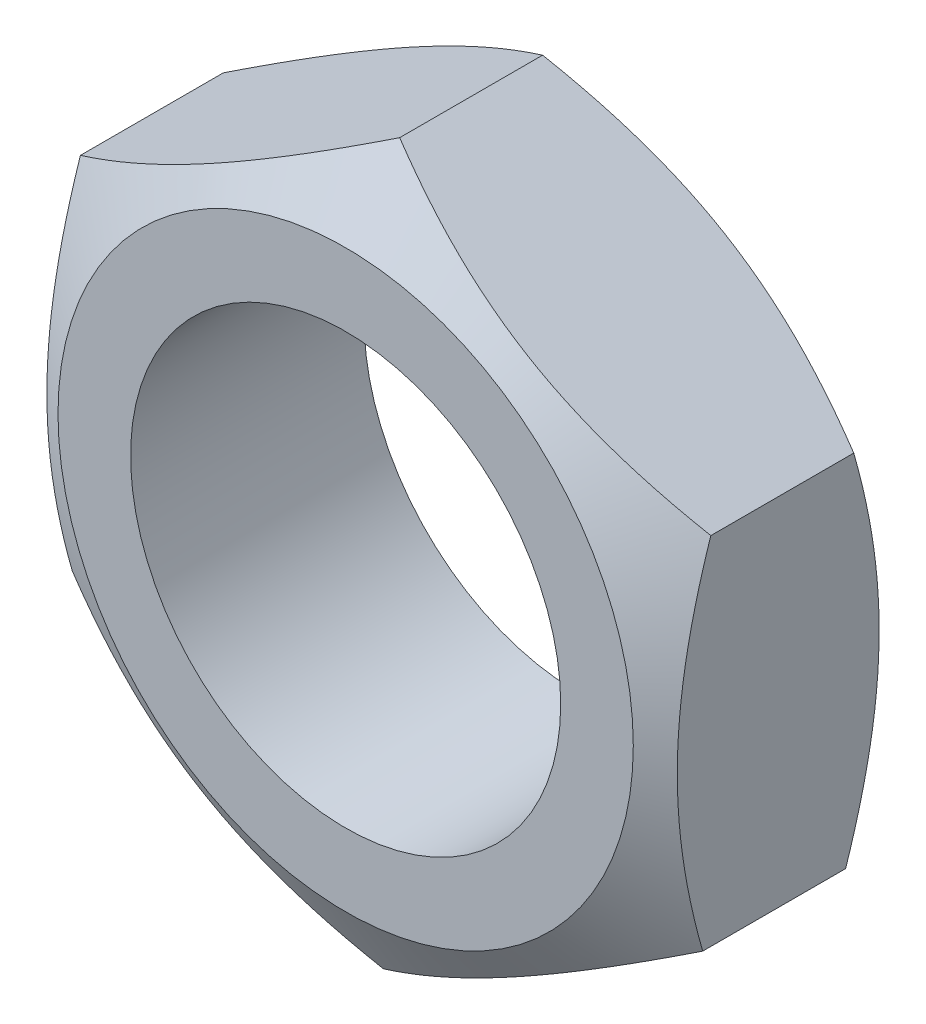
ISO-10303-21;
HEADER;
FILE_DESCRIPTION(('STEP AP214'),'2;1');
FILE_NAME('part.step','',(''),(''),'','','');
FILE_SCHEMA(('AUTOMOTIVE_DESIGN { 1 0 10303 214 1 1 1 1 }'));
ENDSEC;
DATA;
#1=APPLICATION_CONTEXT('core data for automotive mechanical design processes');
#2=APPLICATION_PROTOCOL_DEFINITION('international standard','automotive_design',2000,#1);
#3=PRODUCT_CONTEXT('',#1,'mechanical');
#4=PRODUCT('Part','Part','',(#3));
#5=PRODUCT_RELATED_PRODUCT_CATEGORY('part','',(#4));
#6=PRODUCT_DEFINITION_FORMATION('','',#4);
#7=PRODUCT_DEFINITION_CONTEXT('part definition',#1,'design');
#8=PRODUCT_DEFINITION('design','',#6,#7);
#9=PRODUCT_DEFINITION_SHAPE('','',#8);
#10=(LENGTH_UNIT() NAMED_UNIT(*) SI_UNIT(.MILLI.,.METRE.));
#11=(NAMED_UNIT(*) PLANE_ANGLE_UNIT() SI_UNIT($,.RADIAN.));
#12=(NAMED_UNIT(*) SI_UNIT($,.STERADIAN.) SOLID_ANGLE_UNIT());
#13=UNCERTAINTY_MEASURE_WITH_UNIT(LENGTH_MEASURE(1.E-05),#10,'distance_accuracy_value','');
#14=(GEOMETRIC_REPRESENTATION_CONTEXT(3) GLOBAL_UNCERTAINTY_ASSIGNED_CONTEXT((#13)) GLOBAL_UNIT_ASSIGNED_CONTEXT((#10,
#11,#12)) REPRESENTATION_CONTEXT('',''));
#15=CARTESIAN_POINT('',(0.,0.,0.));
#16=DIRECTION('',(0.,0.,1.));
#17=DIRECTION('',(1.,0.,0.));
#18=AXIS2_PLACEMENT_3D('',#15,#16,#17);
#19=CARTESIAN_POINT('',(0.348146008174675,15.5845691104051,10.));
#20=DIRECTION('',(0.480533842384557,-0.876976183441223,0.));
#21=DIRECTION('',(0.876976183441223,0.480533842384557,0.));
#22=AXIS2_PLACEMENT_3D('',#19,#20,#21);
#23=PLANE('',#22);
#24=CARTESIAN_POINT('',(-13.3227597525577,8.09367825370692,1.91474879700733));
#25=CARTESIAN_POINT('',(-13.0211836543349,8.25892506882757,1.81144380766582));
#26=CARTESIAN_POINT('',(-12.7183366232978,8.42486828396485,1.71281104702541));
#27=CARTESIAN_POINT('',(-12.1100109289307,8.75819670137794,1.52622281394296));
#28=CARTESIAN_POINT('',(-11.8045313455138,8.92558240780996,1.43827125135241));
#29=CARTESIAN_POINT('',(-11.1902845482465,9.2621552580612,1.27424565307524));
#30=CARTESIAN_POINT('',(-10.8815109135654,9.43134592013611,1.19820264669275));
#31=CARTESIAN_POINT('',(-10.2616360306035,9.77100264620423,1.05969587984507));
#32=CARTESIAN_POINT('',(-9.95053493196341,9.94146862820272,0.997231254009499));
#33=CARTESIAN_POINT('',(-9.33464844275874,10.2789399378213,0.888695138455347));
#34=CARTESIAN_POINT('',(-9.0299167671724,10.4459158326412,0.842229769183673));
#35=CARTESIAN_POINT('',(-8.41894736776228,10.7806928523841,0.764503504753746));
#36=CARTESIAN_POINT('',(-8.11270961242546,10.9484939945745,0.73324292911783));
#37=CARTESIAN_POINT('',(-7.49969931931603,11.284389309785,0.686745807400355));
#38=CARTESIAN_POINT('',(-7.19292802011222,11.4524828041389,0.671488175139057));
#39=CARTESIAN_POINT('',(-6.57910024801364,11.7888260520609,0.65733061798929));
#40=CARTESIAN_POINT('',(-6.27204378550319,11.9570757999391,0.65843011913612));
#41=CARTESIAN_POINT('',(-5.70069806890619,12.2701412602221,0.675671082188222));
#42=CARTESIAN_POINT('',(-5.4363580994215,12.4149847618254,0.68971450821679));
#43=CARTESIAN_POINT('',(-4.90834885880868,12.7043042598882,0.729646425322509));
#44=CARTESIAN_POINT('',(-4.64467963949816,12.8487802279545,0.755535805172552));
#45=CARTESIAN_POINT('',(-4.11815783933102,13.1372846919421,0.818705045583946));
#46=CARTESIAN_POINT('',(-3.85530621131765,13.2813126657585,0.855995174327974));
#47=CARTESIAN_POINT('',(-3.33093541311632,13.5686385011138,0.941305276146218));
#48=CARTESIAN_POINT('',(-3.06941634139293,13.7119363086996,0.989326030691836));
#49=CARTESIAN_POINT('',(-2.27485721581141,14.147310218307,1.15086231754135));
#50=CARTESIAN_POINT('',(-1.7443033214066,14.4380240441603,1.28029878700025));
#51=CARTESIAN_POINT('',(-0.691697630845464,15.0147930221004,1.57354650828278));
#52=CARTESIAN_POINT('',(-0.169630075571799,15.3008568093011,1.73728363696309));
#53=CARTESIAN_POINT('',(0.348346008174675,15.5846786992061,1.91474879700733));
#54=B_SPLINE_CURVE_WITH_KNOTS('',3,(#24,#25,#26,#27,#28,#29,#30,#31,#32,#33,#34,#35,#36,#37,#38,
#39,#40,#41,#42,#43,#44,#45,#46,#47,#48,#49,#50,#51,#52,#53),.UNSPECIFIED.,.F.,.F.,(4,2,2,2,2,2,
2,2,2,2,2,2,2,2,4),(0.,1.07722236011842,2.1548378563849,3.23521610732159,4.31552548394719,
5.36693157631782,6.41835976259027,7.46840079383787,8.51840497968903,9.42341919909554,
10.3285013306383,11.2344010456826,12.1403667555333,13.9951707316978,15.8460071084866),.UNSPECIFIED.);
#55=CARTESIAN_POINT('',(-13.3225597525577,8.09378784250795,1.91468028121144));
#56=VERTEX_POINT('',#55);
#57=CARTESIAN_POINT('',(0.348146008174675,15.5845691104051,1.91468028121144));
#58=VERTEX_POINT('',#57);
#59=EDGE_CURVE('E53',#56,#58,#54,.T.);
#60=ORIENTED_EDGE('',*,*,#59,.F.);
#61=DIRECTION('',(0.,0.,-1.));
#62=VECTOR('',#61,1.);
#63=CARTESIAN_POINT('',(-13.3225597525577,8.09378784250795,10.));
#64=LINE('',#63,#62);
#65=CARTESIAN_POINT('',(-13.3225597525577,8.09378784250795,8.03428968243642));
#66=VERTEX_POINT('',#65);
#67=EDGE_CURVE('E46',#66,#56,#64,.T.);
#68=ORIENTED_EDGE('',*,*,#67,.F.);
#69=CARTESIAN_POINT('',(0.348346008174675,15.5846786992061,8.03422116664054));
#70=CARTESIAN_POINT('',(0.0467699099519139,15.4194318840855,8.13752615598205));
#71=CARTESIAN_POINT('',(-0.256077121085281,15.2534886689482,8.23615891662246));
#72=CARTESIAN_POINT('',(-0.864402815452306,14.9201602515351,8.4227471497049));
#73=CARTESIAN_POINT('',(-1.16988239886921,14.7527745451031,8.51069871229546));
#74=CARTESIAN_POINT('',(-1.78412919613652,14.4162016948518,8.67472431057262));
#75=CARTESIAN_POINT('',(-2.09290283081762,14.2470110327769,8.75076731695511));
#76=CARTESIAN_POINT('',(-2.71277771377951,13.9073543067088,8.8892740838028));
#77=CARTESIAN_POINT('',(-3.02387881241963,13.7368883247103,8.95173870963836));
#78=CARTESIAN_POINT('',(-3.63976530162429,13.3994170150917,9.06027482519252));
#79=CARTESIAN_POINT('',(-3.94449697721063,13.2324411202718,9.10674019446419));
#80=CARTESIAN_POINT('',(-4.55546637662075,12.897664100529,9.18446645889412));
#81=CARTESIAN_POINT('',(-4.86170413195757,12.7298629583386,9.21572703453004));
#82=CARTESIAN_POINT('',(-5.474714425067,12.393967643128,9.26222415624751));
#83=CARTESIAN_POINT('',(-5.78148572427081,12.2258741487742,9.27748178850881));
#84=CARTESIAN_POINT('',(-6.39531349636939,11.8895309008521,9.29163934565857));
#85=CARTESIAN_POINT('',(-6.70236995887984,11.721281152974,9.29053984451174));
#86=CARTESIAN_POINT('',(-7.27371567547684,11.4082156926909,9.27329888145964));
#87=CARTESIAN_POINT('',(-7.53805564496153,11.2633721910876,9.25925545543107));
#88=CARTESIAN_POINT('',(-8.06606488557435,10.9740526930248,9.21932353832535));
#89=CARTESIAN_POINT('',(-8.32973410488487,10.8295767249585,9.19343415847531));
#90=CARTESIAN_POINT('',(-8.85625590505201,10.5410722609709,9.13026491806392));
#91=CARTESIAN_POINT('',(-9.11910753306539,10.3970442871545,9.09297478931989));
#92=CARTESIAN_POINT('',(-9.64347833126671,10.1097184517992,9.00766468750165));
#93=CARTESIAN_POINT('',(-9.90499740299011,9.96642064421343,8.95964393295603));
#94=CARTESIAN_POINT('',(-10.6995565285716,9.531046734606,8.79810764610651));
#95=CARTESIAN_POINT('',(-11.2301104229764,9.24033290875269,8.66867117664762));
#96=CARTESIAN_POINT('',(-12.2827161135376,8.66356393081261,8.37542345536508));
#97=CARTESIAN_POINT('',(-12.8047836688112,8.37750014361196,8.21168632668477));
#98=CARTESIAN_POINT('',(-13.3227597525577,8.09367825370692,8.03422116664053));
#99=B_SPLINE_CURVE_WITH_KNOTS('',3,(#69,#70,#71,#72,#73,#74,#75,#76,#77,#78,#79,#80,#81,#82,#83,
#84,#85,#86,#87,#88,#89,#90,#91,#92,#93,#94,#95,#96,#97,#98),.UNSPECIFIED.,.F.,.F.,(4,2,2,2,2,2,
2,2,2,2,2,2,2,2,4),(0.,1.07722236011843,2.1548378563849,3.23521610732159,4.31552548394719,
5.36693157631781,6.41835976259027,7.46840079383787,8.51840497968903,9.42341919909554,
10.3285013306383,11.2344010456826,12.1403667555333,13.9951707316978,15.8460071084866),.UNSPECIFIED.);
#100=CARTESIAN_POINT('',(0.348146008174675,15.5845691104051,8.03428968243642));
#101=VERTEX_POINT('',#100);
#102=EDGE_CURVE('E131',#101,#66,#99,.T.);
#103=ORIENTED_EDGE('',*,*,#102,.F.);
#104=DIRECTION('',(0.,0.,-1.));
#105=VECTOR('',#104,1.);
#106=CARTESIAN_POINT('',(0.348146008174675,15.5845691104051,10.));
#107=LINE('',#106,#105);
#108=EDGE_CURVE('E108',#101,#58,#107,.T.);
#109=ORIENTED_EDGE('',*,*,#108,.T.);
#110=EDGE_LOOP('',(#60,#68,#103,#109));
#111=FACE_BOUND('',#110,.T.);
#112=ADVANCED_FACE('F33',(#111),#23,.F.);
#113=CARTESIAN_POINT('',(-13.3225597525577,8.09378784250795,10.));
#114=DIRECTION('',(0.9997505745663,-0.0223335768374375,0.));
#115=DIRECTION('',(0.0223335768374375,0.9997505745663,0.));
#116=AXIS2_PLACEMENT_3D('',#113,#114,#115);
#117=PLANE('',#116);
#118=CARTESIAN_POINT('',(-13.6707102285621,-7.49098126789712,1.91474038284253));
#119=CARTESIAN_POINT('',(-13.663030124391,-7.14718552869685,1.81143574092546));
#120=CARTESIAN_POINT('',(-13.655317653942,-6.80194093044568,1.71280333669261));
#121=CARTESIAN_POINT('',(-13.6398256945055,-6.10845168505808,1.52621583265449));
#122=CARTESIAN_POINT('',(-13.6320461820866,-5.76020598902686,1.43826464270555));
#123=CARTESIAN_POINT('',(-13.6164034329577,-5.05996672403161,1.27423980695369));
#124=CARTESIAN_POINT('',(-13.6085400327333,-4.70796583542905,1.19819719018768));
#125=CARTESIAN_POINT('',(-13.5927539561999,-4.00131059613291,1.05969121176616));
#126=CARTESIAN_POINT('',(-13.5848312837018,-3.64665641602829,0.997226984741185));
#127=CARTESIAN_POINT('',(-13.5691467775581,-2.9445479206848,0.888691653428463));
#128=CARTESIAN_POINT('',(-13.5613863118354,-2.59715483978193,0.842226670883884));
#129=CARTESIAN_POINT('',(-13.5458270268609,-1.90065180283952,0.764501176922913));
#130=CARTESIAN_POINT('',(-13.5380282068066,-1.55154181087499,0.733240985033619));
#131=CARTESIAN_POINT('',(-13.522416947929,-0.852712190068609,0.686744617427944));
#132=CARTESIAN_POINT('',(-13.5146045406471,-0.502993973158491,0.671487355704391));
#133=CARTESIAN_POINT('',(-13.4989724640727,0.196767540670505,0.657330517188794));
#134=CARTESIAN_POINT('',(-13.4911527950446,0.546810825751623,0.658430366420144));
#135=CARTESIAN_POINT('',(-13.4766026313398,1.19814109092995,0.675671899544916));
#136=CARTESIAN_POINT('',(-13.4698708450258,1.49948589047655,0.689715478356203));
#137=CARTESIAN_POINT('',(-13.4564243527259,2.10141089785779,0.729647531505815));
#138=CARTESIAN_POINT('',(-13.4497096480595,2.40199104662195,0.755536894585893));
#139=CARTESIAN_POINT('',(-13.4363010355972,3.00222038341377,0.818705938615438));
#140=CARTESIAN_POINT('',(-13.4296071520662,3.30186848523732,0.85599588738103));
#141=CARTESIAN_POINT('',(-13.4162533176948,3.89964571020233,0.941305478822691));
#142=CARTESIAN_POINT('',(-13.409593369362,4.19777472109764,0.989325902947332));
#143=CARTESIAN_POINT('',(-13.3893588142773,5.10356371402533,1.15086095399664));
#144=CARTESIAN_POINT('',(-13.3758475205419,5.70838952286716,1.28029629407202));
#145=CARTESIAN_POINT('',(-13.3490414489043,6.90834892554668,1.57354133350944));
#146=CARTESIAN_POINT('',(-13.3357462696846,7.5035004841442,1.73727691202011));
#147=CARTESIAN_POINT('',(-13.322555284728,8.09398784250795,1.91474038284253));
#148=B_SPLINE_CURVE_WITH_KNOTS('',3,(#118,#119,#120,#121,#122,#123,#124,#125,#126,#127,#128,
#129,#130,#131,#132,#133,#134,#135,#136,#137,#138,#139,#140,#141,#142,#143,#144,#145,#146,#147),
.UNSPECIFIED.,.F.,.F.,(4,2,2,2,2,2,2,2,2,2,2,2,2,2,4),(0.,1.07722139744809,2.15483593059128,
3.23521318892921,4.31552157313823,5.36692680094432,6.41835412296775,7.46839430136803,
8.51839763358703,9.42340564467492,10.3284815660259,11.234375047758,12.1403345228396,
13.9951253283491,15.8459486360334),.UNSPECIFIED.);
#149=CARTESIAN_POINT('',(-13.6707057607324,-7.49078126789712,1.91468028121143));
#150=VERTEX_POINT('',#149);
#151=EDGE_CURVE('E127',#150,#56,#148,.T.);
#152=ORIENTED_EDGE('',*,*,#151,.F.);
#153=DIRECTION('',(0.,0.,-1.));
#154=VECTOR('',#153,1.);
#155=CARTESIAN_POINT('',(-13.6707057607324,-7.49078126789712,10.));
#156=LINE('',#155,#154);
#157=CARTESIAN_POINT('',(-13.6707057607324,-7.49078126789712,8.03428968243643));
#158=VERTEX_POINT('',#157);
#159=EDGE_CURVE('E118',#158,#150,#156,.T.);
#160=ORIENTED_EDGE('',*,*,#159,.F.);
#161=CARTESIAN_POINT('',(-13.322555284728,8.09398784250795,8.03422958080533));
#162=CARTESIAN_POINT('',(-13.3302353888991,7.75019210330767,8.1375342227224));
#163=CARTESIAN_POINT('',(-13.3379478593481,7.40494750505651,8.23616662695525));
#164=CARTESIAN_POINT('',(-13.3534398187846,6.71145825966891,8.42275413099337));
#165=CARTESIAN_POINT('',(-13.3612193312035,6.36321256363769,8.51070532094231));
#166=CARTESIAN_POINT('',(-13.3768620803323,5.66297329864243,8.67473015669417));
#167=CARTESIAN_POINT('',(-13.3847254805568,5.31097241003988,8.75077277346018));
#168=CARTESIAN_POINT('',(-13.4005115570902,4.60431717074374,8.8892787518817));
#169=CARTESIAN_POINT('',(-13.4084342295883,4.24966299063912,8.95174297890668));
#170=CARTESIAN_POINT('',(-13.424118735732,3.54755449529562,9.0602783102194));
#171=CARTESIAN_POINT('',(-13.4318792014547,3.20016141439275,9.10674329276398));
#172=CARTESIAN_POINT('',(-13.4474384864292,2.50365837745034,9.18446878672495));
#173=CARTESIAN_POINT('',(-13.4552373064835,2.15454838548581,9.21572897861424));
#174=CARTESIAN_POINT('',(-13.4708485653611,1.45571876467943,9.26222534621992));
#175=CARTESIAN_POINT('',(-13.4786609726429,1.10600054776931,9.27748260794347));
#176=CARTESIAN_POINT('',(-13.4942930492174,0.406239033940319,9.29163944645907));
#177=CARTESIAN_POINT('',(-13.5021127182455,0.0561957488591996,9.29053959722772));
#178=CARTESIAN_POINT('',(-13.5166628819503,-0.595134516319126,9.27329806410295));
#179=CARTESIAN_POINT('',(-13.5233946682643,-0.896479315865732,9.25925448529166));
#180=CARTESIAN_POINT('',(-13.5368411605642,-1.49840432324696,9.21932243214205));
#181=CARTESIAN_POINT('',(-13.5435558652305,-1.79898447201113,9.19343306906197));
#182=CARTESIAN_POINT('',(-13.5569644776928,-2.39921380880295,9.13026402503242));
#183=CARTESIAN_POINT('',(-13.5636583612239,-2.6988619106265,9.09297407626683));
#184=CARTESIAN_POINT('',(-13.5770121955953,-3.29663913559151,9.00766448482517));
#185=CARTESIAN_POINT('',(-13.5836721439281,-3.59476814648681,8.95964406070053));
#186=CARTESIAN_POINT('',(-13.6039066990128,-4.5005571394145,8.79810900965123));
#187=CARTESIAN_POINT('',(-13.6174179927481,-5.10538294825633,8.66867366957585));
#188=CARTESIAN_POINT('',(-13.6442240643857,-6.30534235093585,8.37542863013842));
#189=CARTESIAN_POINT('',(-13.6575192436054,-6.90049390953337,8.21169305162776));
#190=CARTESIAN_POINT('',(-13.6707102285621,-7.49098126789712,8.03422958080533));
#191=B_SPLINE_CURVE_WITH_KNOTS('',3,(#161,#162,#163,#164,#165,#166,#167,#168,#169,#170,#171,
#172,#173,#174,#175,#176,#177,#178,#179,#180,#181,#182,#183,#184,#185,#186,#187,#188,#189,#190),
.UNSPECIFIED.,.F.,.F.,(4,2,2,2,2,2,2,2,2,2,2,2,2,2,4),(0.,1.07722139744809,2.15483593059129,
3.23521318892921,4.31552157313824,5.36692680094432,6.41835412296775,7.46839430136803,
8.51839763358703,9.42340564467493,10.3284815660259,11.234375047758,12.1403345228396,
13.9951253283491,15.8459486360334),.UNSPECIFIED.);
#192=EDGE_CURVE('E128',#66,#158,#191,.T.);
#193=ORIENTED_EDGE('',*,*,#192,.F.);
#194=ORIENTED_EDGE('',*,*,#67,.T.);
#195=EDGE_LOOP('',(#152,#160,#193,#194));
#196=FACE_BOUND('',#195,.T.);
#197=ADVANCED_FACE('F125',(#196),#117,.F.);
#198=CARTESIAN_POINT('',(-13.6707057607324,-7.49078126789712,10.));
#199=DIRECTION('',(0.519216732181743,0.854642606603785,0.));
#200=DIRECTION('',(-0.854642606603785,0.519216732181743,0.));
#201=AXIS2_PLACEMENT_3D('',#198,#199,#200);
#202=PLANE('',#201);
#203=CARTESIAN_POINT('',(-0.347946008174666,-15.584690615401,1.91475058748677));
#204=CARTESIAN_POINT('',(-0.641842039022055,-15.4061414352423,1.81144552421575));
#205=CARTESIAN_POINT('',(-0.936976636575299,-15.2268397948709,1.71281268773428));
#206=CARTESIAN_POINT('',(-1.52981044625024,-14.8666784467146,1.52622429951625));
#207=CARTESIAN_POINT('',(-1.82751055502793,-14.6858181941887,1.43827265763014));
#208=CARTESIAN_POINT('',(-2.42611468147581,-14.3221512344524,1.27424689709285));
#209=CARTESIAN_POINT('',(-2.72702495647683,-14.139340725757,1.19820380780267));
#210=CARTESIAN_POINT('',(-3.33111384580929,-13.7723416355608,1.05969687318333));
#211=CARTESIAN_POINT('',(-3.63429231431072,-13.5881531426553,0.997232162483605));
#212=CARTESIAN_POINT('',(-4.23449437794812,-13.2235153961604,0.888695880048261));
#213=CARTESIAN_POINT('',(-4.53146562593313,-13.0430979447728,0.842230428483715));
#214=CARTESIAN_POINT('',(-5.12687581915622,-12.6813713792538,0.764504000103262));
#215=CARTESIAN_POINT('',(-5.42531479510479,-12.500062246465,0.733243342808678));
#216=CARTESIAN_POINT('',(-6.02271391285686,-12.137127359612,0.686746060621332));
#217=CARTESIAN_POINT('',(-6.32167284762759,-11.9555023388504,0.671488349512107));
#218=CARTESIAN_POINT('',(-6.91986863160334,-11.5920834573661,0.657330639441833));
#219=CARTESIAN_POINT('',(-7.21910547068844,-11.4102896027915,0.658430066518615));
#220=CARTESIAN_POINT('',(-7.77590140173826,-11.0720221661134,0.675670908262598));
#221=CARTESIAN_POINT('',(-8.03350991682125,-10.9155185582309,0.689714301779607));
#222=CARTESIAN_POINT('',(-8.54807332853185,-10.6029084320047,0.729646189935384));
#223=CARTESIAN_POINT('',(-8.80502817466121,-10.44680194434,0.755535573353669));
#224=CARTESIAN_POINT('',(-9.31814202454134,-10.1350724631354,0.818704855553339));
#225=CARTESIAN_POINT('',(-9.5743000997082,-9.97945003373342,0.855995022595402));
#226=CARTESIAN_POINT('',(-10.0853177217505,-9.6689940633033,0.941305233018135));
#227=CARTESIAN_POINT('',(-10.3401771726684,-9.51416058057176,0.989326057875063));
#228=CARTESIAN_POINT('',(-11.1145027563343,-9.04373844611561,1.15086260769458));
#229=CARTESIAN_POINT('',(-11.6315460359216,-8.72962173820812,1.28029931747894));
#230=CARTESIAN_POINT('',(-12.657346987956,-8.1064220357024,1.57354760944074));
#231=CARTESIAN_POINT('',(-13.1661200182975,-7.79732971079961,1.73728506798713));
#232=CARTESIAN_POINT('',(-13.6709057607324,-7.49065976290119,1.91475058748677));
#233=B_SPLINE_CURVE_WITH_KNOTS('',3,(#203,#204,#205,#206,#207,#208,#209,#210,#211,#212,#213,
#214,#215,#216,#217,#218,#219,#220,#221,#222,#223,#224,#225,#226,#227,#228,#229,#230,#231,#232),
.UNSPECIFIED.,.F.,.F.,(4,2,2,2,2,2,2,2,2,2,2,2,2,2,4),(0.,1.07722256496838,2.15483826618119,
3.2352167283364,4.31552631614176,5.36693259248609,6.41836096266512,7.46840217539307,
8.51840654289159,9.42342208338537,10.328505536414,11.2344065778641,12.1403736144306,
13.9951803932204,15.846019551025),.UNSPECIFIED.);
#234=CARTESIAN_POINT('',(-0.348146008174666,-15.5845691104051,1.91468028121144));
#235=VERTEX_POINT('',#234);
#236=EDGE_CURVE('E136',#235,#150,#233,.T.);
#237=ORIENTED_EDGE('',*,*,#236,.F.);
#238=DIRECTION('',(0.,0.,-1.));
#239=VECTOR('',#238,1.);
#240=CARTESIAN_POINT('',(-0.348146008174666,-15.5845691104051,10.));
#241=LINE('',#240,#239);
#242=CARTESIAN_POINT('',(-0.348146008174666,-15.5845691104051,8.03428968243643));
#243=VERTEX_POINT('',#242);
#244=EDGE_CURVE('E110',#243,#235,#241,.T.);
#245=ORIENTED_EDGE('',*,*,#244,.F.);
#246=CARTESIAN_POINT('',(-13.6709057607324,-7.49065976290119,8.03421937616109));
#247=CARTESIAN_POINT('',(-13.377009729885,-7.66920894305985,8.13752443943212));
#248=CARTESIAN_POINT('',(-13.0818751323317,-7.84851058343128,8.23615727591359));
#249=CARTESIAN_POINT('',(-12.4890413226568,-8.20867193158763,8.42274566413161));
#250=CARTESIAN_POINT('',(-12.1913412138791,-8.38953218411347,8.51069730601773));
#251=CARTESIAN_POINT('',(-11.5927370874312,-8.75319914384985,8.67472306655501));
#252=CARTESIAN_POINT('',(-11.2918268124302,-8.93600965254517,8.75076615584519));
#253=CARTESIAN_POINT('',(-10.6877379230977,-9.30300874274138,8.88927309046454));
#254=CARTESIAN_POINT('',(-10.3845594545963,-9.48719723564687,8.95173780116426));
#255=CARTESIAN_POINT('',(-9.78435739095892,-9.8518349821418,9.0602740835996));
#256=CARTESIAN_POINT('',(-9.48738614297392,-10.0322524335294,9.10673953516415));
#257=CARTESIAN_POINT('',(-8.89197594975082,-10.3939789990484,9.1844659635446));
#258=CARTESIAN_POINT('',(-8.59353697380225,-10.5752881318372,9.21572662083919));
#259=CARTESIAN_POINT('',(-7.99613785605018,-10.9382230186902,9.26222390302653));
#260=CARTESIAN_POINT('',(-7.69717892127946,-11.1198480394518,9.27748161413576));
#261=CARTESIAN_POINT('',(-7.0989831373037,-11.4832669209361,9.29163932420603));
#262=CARTESIAN_POINT('',(-6.7997462982186,-11.6650607755107,9.29053989712925));
#263=CARTESIAN_POINT('',(-6.24295036716878,-12.0033282121888,9.27329905538526));
#264=CARTESIAN_POINT('',(-5.9853418520858,-12.1598318200713,9.25925566186826));
#265=CARTESIAN_POINT('',(-5.4707784403752,-12.4724419462975,9.21932377371248));
#266=CARTESIAN_POINT('',(-5.21382359424583,-12.6285484339622,9.1934343902942));
#267=CARTESIAN_POINT('',(-4.7007097443657,-12.9402779151668,9.13026510809452));
#268=CARTESIAN_POINT('',(-4.44455166919884,-13.0959003445688,9.09297494105246));
#269=CARTESIAN_POINT('',(-3.9335340471565,-13.4063563149989,9.00766473062973));
#270=CARTESIAN_POINT('',(-3.6786745962386,-13.5611897977304,8.9596439057728));
#271=CARTESIAN_POINT('',(-2.90434901257272,-14.0316119321866,8.79810735595328));
#272=CARTESIAN_POINT('',(-2.3873057329854,-14.3457286400941,8.66867064616893));
#273=CARTESIAN_POINT('',(-1.36150478095105,-14.9689283425998,8.37542235420712));
#274=CARTESIAN_POINT('',(-0.852731750609505,-15.2780206675026,8.21168489566073));
#275=CARTESIAN_POINT('',(-0.347946008174665,-15.584690615401,8.03421937616109));
#276=B_SPLINE_CURVE_WITH_KNOTS('',3,(#246,#247,#248,#249,#250,#251,#252,#253,#254,#255,#256,
#257,#258,#259,#260,#261,#262,#263,#264,#265,#266,#267,#268,#269,#270,#271,#272,#273,#274,#275),
.UNSPECIFIED.,.F.,.F.,(4,2,2,2,2,2,2,2,2,2,2,2,2,2,4),(0.,1.07722256496838,2.15483826618119,
3.2352167283364,4.31552631614176,5.36693259248609,6.41836096266511,7.46840217539306,
8.51840654289159,9.42342208338537,10.328505536414,11.2344065778641,12.1403736144306,
13.9951803932204,15.846019551025),.UNSPECIFIED.);
#277=EDGE_CURVE('E184',#158,#243,#276,.T.);
#278=ORIENTED_EDGE('',*,*,#277,.F.);
#279=ORIENTED_EDGE('',*,*,#159,.T.);
#280=EDGE_LOOP('',(#237,#245,#278,#279));
#281=FACE_BOUND('',#280,.T.);
#282=ADVANCED_FACE('F175',(#281),#202,.F.);
#283=CARTESIAN_POINT('',(-0.348146008174666,-15.5845691104051,10.));
#284=DIRECTION('',(-0.480533842384556,0.876976183441224,0.));
#285=DIRECTION('',(-0.876976183441224,-0.480533842384556,0.));
#286=AXIS2_PLACEMENT_3D('',#283,#284,#285);
#287=PLANE('',#286);
#288=CARTESIAN_POINT('',(13.3227597525577,-8.09367825370693,1.91474879700733));
#289=CARTESIAN_POINT('',(13.0211836543349,-8.25892506882758,1.81144380766582));
#290=CARTESIAN_POINT('',(12.7183366232978,-8.42486828396486,1.71281104702541));
#291=CARTESIAN_POINT('',(12.1100109289307,-8.75819670137796,1.52622281394297));
#292=CARTESIAN_POINT('',(11.8045313455138,-8.92558240780997,1.43827125135241));
#293=CARTESIAN_POINT('',(11.1902845482465,-9.26215525806121,1.27424565307524));
#294=CARTESIAN_POINT('',(10.8815109135654,-9.43134592013612,1.19820264669276));
#295=CARTESIAN_POINT('',(10.2616360306035,-9.77100264620424,1.05969587984507));
#296=CARTESIAN_POINT('',(9.95053493196341,-9.94146862820272,0.997231254009504));
#297=CARTESIAN_POINT('',(9.33464844275874,-10.2789399378213,0.888695138455352));
#298=CARTESIAN_POINT('',(9.02991676717241,-10.4459158326412,0.842229769183679));
#299=CARTESIAN_POINT('',(8.41894736776228,-10.7806928523841,0.764503504753752));
#300=CARTESIAN_POINT('',(8.11270961242546,-10.9484939945745,0.733242929117835));
#301=CARTESIAN_POINT('',(7.49969931931603,-11.284389309785,0.686745807400359));
#302=CARTESIAN_POINT('',(7.19292802011222,-11.4524828041389,0.671488175139061));
#303=CARTESIAN_POINT('',(6.57910024801364,-11.7888260520609,0.657330617989294));
#304=CARTESIAN_POINT('',(6.27204378550319,-11.9570757999391,0.658430119136124));
#305=CARTESIAN_POINT('',(5.70069806890619,-12.2701412602221,0.675671082188227));
#306=CARTESIAN_POINT('',(5.4363580994215,-12.4149847618254,0.689714508216794));
#307=CARTESIAN_POINT('',(4.90834885880869,-12.7043042598882,0.729646425322513));
#308=CARTESIAN_POINT('',(4.64467963949816,-12.8487802279546,0.755535805172556));
#309=CARTESIAN_POINT('',(4.11815783933102,-13.1372846919421,0.81870504558395));
#310=CARTESIAN_POINT('',(3.85530621131765,-13.2813126657585,0.855995174327977));
#311=CARTESIAN_POINT('',(3.33093541311633,-13.5686385011138,0.941305276146222));
#312=CARTESIAN_POINT('',(3.06941634139293,-13.7119363086996,0.98932603069184));
#313=CARTESIAN_POINT('',(2.27485721581141,-14.147310218307,1.15086231754136));
#314=CARTESIAN_POINT('',(1.74430332140661,-14.4380240441603,1.28029878700025));
#315=CARTESIAN_POINT('',(0.691697630845471,-15.0147930221004,1.57354650828279));
#316=CARTESIAN_POINT('',(0.169630075571807,-15.3008568093011,1.73728363696309));
#317=CARTESIAN_POINT('',(-0.348346008174666,-15.5846786992061,1.91474879700733));
#318=B_SPLINE_CURVE_WITH_KNOTS('',3,(#288,#289,#290,#291,#292,#293,#294,#295,#296,#297,#298,
#299,#300,#301,#302,#303,#304,#305,#306,#307,#308,#309,#310,#311,#312,#313,#314,#315,#316,#317),
.UNSPECIFIED.,.F.,.F.,(4,2,2,2,2,2,2,2,2,2,2,2,2,2,4),(0.,1.07722236011843,2.1548378563849,
3.23521610732159,4.31552548394719,5.36693157631782,6.41835976259028,7.46840079383787,
8.51840497968903,9.42341919909554,10.3285013306383,11.2344010456826,12.1403667555333,
13.9951707316978,15.8460071084866),.UNSPECIFIED.);
#319=CARTESIAN_POINT('',(13.3225597525577,-8.09378784250796,1.91468028121144));
#320=VERTEX_POINT('',#319);
#321=EDGE_CURVE('E105',#320,#235,#318,.T.);
#322=ORIENTED_EDGE('',*,*,#321,.F.);
#323=DIRECTION('',(0.,0.,-1.));
#324=VECTOR('',#323,1.);
#325=CARTESIAN_POINT('',(13.3225597525577,-8.09378784250796,10.));
#326=LINE('',#325,#324);
#327=CARTESIAN_POINT('',(13.3225597525577,-8.09378784250796,8.03428968243642));
#328=VERTEX_POINT('',#327);
#329=EDGE_CURVE('E104',#328,#320,#326,.T.);
#330=ORIENTED_EDGE('',*,*,#329,.F.);
#331=CARTESIAN_POINT('',(-0.348346008174666,-15.5846786992061,8.03422116664054));
#332=CARTESIAN_POINT('',(-0.0467699099519032,-15.4194318840855,8.13752615598204));
#333=CARTESIAN_POINT('',(0.256077121085291,-15.2534886689482,8.23615891662246));
#334=CARTESIAN_POINT('',(0.864402815452315,-14.9201602515351,8.4227471497049));
#335=CARTESIAN_POINT('',(1.16988239886922,-14.7527745451031,8.51069871229546));
#336=CARTESIAN_POINT('',(1.78412919613653,-14.4162016948518,8.67472431057262));
#337=CARTESIAN_POINT('',(2.09290283081763,-14.2470110327769,8.75076731695511));
#338=CARTESIAN_POINT('',(2.71277771377952,-13.9073543067088,8.88927408380279));
#339=CARTESIAN_POINT('',(3.02387881241964,-13.7368883247103,8.95173870963836));
#340=CARTESIAN_POINT('',(3.6397653016243,-13.3994170150917,9.06027482519251));
#341=CARTESIAN_POINT('',(3.94449697721064,-13.2324411202718,9.10674019446419));
#342=CARTESIAN_POINT('',(4.55546637662076,-12.897664100529,9.18446645889411));
#343=CARTESIAN_POINT('',(4.86170413195758,-12.7298629583386,9.21572703453003));
#344=CARTESIAN_POINT('',(5.47471442506701,-12.393967643128,9.26222415624751));
#345=CARTESIAN_POINT('',(5.78148572427082,-12.2258741487742,9.2774817885088));
#346=CARTESIAN_POINT('',(6.3953134963694,-11.8895309008521,9.29163934565857));
#347=CARTESIAN_POINT('',(6.70236995887985,-11.721281152974,9.29053984451174));
#348=CARTESIAN_POINT('',(7.27371567547685,-11.4082156926909,9.27329888145964));
#349=CARTESIAN_POINT('',(7.53805564496154,-11.2633721910876,9.25925545543107));
#350=CARTESIAN_POINT('',(8.06606488557435,-10.9740526930249,9.21932353832535));
#351=CARTESIAN_POINT('',(8.32973410488488,-10.8295767249585,9.19343415847531));
#352=CARTESIAN_POINT('',(8.85625590505202,-10.5410722609709,9.13026491806391));
#353=CARTESIAN_POINT('',(9.11910753306539,-10.3970442871545,9.09297478931988));
#354=CARTESIAN_POINT('',(9.64347833126672,-10.1097184517992,9.00766468750164));
#355=CARTESIAN_POINT('',(9.90499740299011,-9.96642064421343,8.95964393295602));
#356=CARTESIAN_POINT('',(10.6995565285716,-9.53104673460601,8.7981076461065));
#357=CARTESIAN_POINT('',(11.2301104229764,-9.2403329087527,8.66867117664761));
#358=CARTESIAN_POINT('',(12.2827161135376,-8.66356393081262,8.37542345536507));
#359=CARTESIAN_POINT('',(12.8047836688112,-8.37750014361197,8.21168632668476));
#360=CARTESIAN_POINT('',(13.3227597525577,-8.09367825370693,8.03422116664053));
#361=B_SPLINE_CURVE_WITH_KNOTS('',3,(#331,#332,#333,#334,#335,#336,#337,#338,#339,#340,#341,
#342,#343,#344,#345,#346,#347,#348,#349,#350,#351,#352,#353,#354,#355,#356,#357,#358,#359,#360),
.UNSPECIFIED.,.F.,.F.,(4,2,2,2,2,2,2,2,2,2,2,2,2,2,4),(0.,1.07722236011842,2.1548378563849,
3.23521610732159,4.31552548394718,5.36693157631781,6.41835976259027,7.46840079383787,
8.51840497968903,9.42341919909553,10.3285013306383,11.2344010456826,12.1403667555333,
13.9951707316978,15.8460071084866),.UNSPECIFIED.);
#362=EDGE_CURVE('E190',#243,#328,#361,.T.);
#363=ORIENTED_EDGE('',*,*,#362,.F.);
#364=ORIENTED_EDGE('',*,*,#244,.T.);
#365=EDGE_LOOP('',(#322,#330,#363,#364));
#366=FACE_BOUND('',#365,.T.);
#367=ADVANCED_FACE('F178',(#366),#287,.F.);
#368=CARTESIAN_POINT('',(13.3225597525577,-8.09378784250796,10.));
#369=DIRECTION('',(-0.9997505745663,0.0223335768374379,0.));
#370=DIRECTION('',(-0.0223335768374379,-0.9997505745663,0.));
#371=AXIS2_PLACEMENT_3D('',#368,#369,#370);
#372=PLANE('',#371);
#373=CARTESIAN_POINT('',(13.6707102285621,7.49098126789712,1.91474038284254));
#374=CARTESIAN_POINT('',(13.663030124391,7.14718552869685,1.81143574092546));
#375=CARTESIAN_POINT('',(13.655317653942,6.80194093044568,1.71280333669262));
#376=CARTESIAN_POINT('',(13.6398256945055,6.10845168505808,1.5262158326545));
#377=CARTESIAN_POINT('',(13.6320461820866,5.76020598902686,1.43826464270556));
#378=CARTESIAN_POINT('',(13.6164034329577,5.05996672403161,1.27423980695369));
#379=CARTESIAN_POINT('',(13.6085400327333,4.70796583542905,1.19819719018768));
#380=CARTESIAN_POINT('',(13.5927539561999,4.00131059613291,1.05969121176616));
#381=CARTESIAN_POINT('',(13.5848312837018,3.64665641602829,0.997226984741189));
#382=CARTESIAN_POINT('',(13.5691467775581,2.9445479206848,0.888691653428467));
#383=CARTESIAN_POINT('',(13.5613863118354,2.59715483978193,0.842226670883888));
#384=CARTESIAN_POINT('',(13.5458270268609,1.90065180283952,0.764501176922916));
#385=CARTESIAN_POINT('',(13.5380282068066,1.55154181087499,0.733240985033623));
#386=CARTESIAN_POINT('',(13.522416947929,0.852712190068606,0.686744617427947));
#387=CARTESIAN_POINT('',(13.5146045406471,0.502993973158488,0.671487355704394));
#388=CARTESIAN_POINT('',(13.4989724640727,-0.196767540670508,0.657330517188797));
#389=CARTESIAN_POINT('',(13.4911527950446,-0.546810825751626,0.658430366420148));
#390=CARTESIAN_POINT('',(13.4766026313398,-1.19814109092995,0.67567189954492));
#391=CARTESIAN_POINT('',(13.4698708450258,-1.49948589047656,0.689715478356206));
#392=CARTESIAN_POINT('',(13.4564243527259,-2.10141089785779,0.729647531505818));
#393=CARTESIAN_POINT('',(13.4497096480595,-2.40199104662196,0.755536894585896));
#394=CARTESIAN_POINT('',(13.4363010355972,-3.00222038341378,0.818705938615442));
#395=CARTESIAN_POINT('',(13.4296071520662,-3.30186848523733,0.855995887381034));
#396=CARTESIAN_POINT('',(13.4162533176948,-3.89964571020234,0.941305478822694));
#397=CARTESIAN_POINT('',(13.409593369362,-4.19777472109764,0.989325902947335));
#398=CARTESIAN_POINT('',(13.3893588142773,-5.10356371402534,1.15086095399664));
#399=CARTESIAN_POINT('',(13.3758475205419,-5.70838952286717,1.28029629407202));
#400=CARTESIAN_POINT('',(13.3490414489043,-6.90834892554669,1.57354133350945));
#401=CARTESIAN_POINT('',(13.3357462696846,-7.50350048414421,1.73727691202011));
#402=CARTESIAN_POINT('',(13.322555284728,-8.09398784250796,1.91474038284254));
#403=B_SPLINE_CURVE_WITH_KNOTS('',3,(#373,#374,#375,#376,#377,#378,#379,#380,#381,#382,#383,
#384,#385,#386,#387,#388,#389,#390,#391,#392,#393,#394,#395,#396,#397,#398,#399,#400,#401,#402),
.UNSPECIFIED.,.F.,.F.,(4,2,2,2,2,2,2,2,2,2,2,2,2,2,4),(0.,1.07722139744809,2.15483593059129,
3.23521318892921,4.31552157313823,5.36692680094432,6.41835412296775,7.46839430136803,
8.51839763358703,9.42340564467493,10.3284815660259,11.234375047758,12.1403345228396,
13.9951253283491,15.8459486360334),.UNSPECIFIED.);
#404=CARTESIAN_POINT('',(13.6707057607324,7.49078126789713,1.91468028121144));
#405=VERTEX_POINT('',#404);
#406=EDGE_CURVE('E90',#405,#320,#403,.T.);
#407=ORIENTED_EDGE('',*,*,#406,.F.);
#408=DIRECTION('',(0.,0.,-1.));
#409=VECTOR('',#408,1.);
#410=CARTESIAN_POINT('',(13.6707057607324,7.49078126789713,10.));
#411=LINE('',#410,#409);
#412=CARTESIAN_POINT('',(13.6707057607324,7.49078126789713,8.03428968243642));
#413=VERTEX_POINT('',#412);
#414=EDGE_CURVE('E102',#413,#405,#411,.T.);
#415=ORIENTED_EDGE('',*,*,#414,.F.);
#416=CARTESIAN_POINT('',(13.322555284728,-8.09398784250796,8.03422958080532));
#417=CARTESIAN_POINT('',(13.3302353888991,-7.75019210330768,8.13753422272239));
#418=CARTESIAN_POINT('',(13.3379478593481,-7.40494750505652,8.23616662695524));
#419=CARTESIAN_POINT('',(13.3534398187846,-6.71145825966892,8.42275413099336));
#420=CARTESIAN_POINT('',(13.3612193312035,-6.3632125636377,8.5107053209423));
#421=CARTESIAN_POINT('',(13.3768620803323,-5.66297329864244,8.67473015669417));
#422=CARTESIAN_POINT('',(13.3847254805568,-5.31097241003989,8.75077277346018));
#423=CARTESIAN_POINT('',(13.4005115570902,-4.60431717074375,8.8892787518817));
#424=CARTESIAN_POINT('',(13.4084342295883,-4.24966299063913,8.95174297890667));
#425=CARTESIAN_POINT('',(13.424118735732,-3.54755449529564,9.06027831021939));
#426=CARTESIAN_POINT('',(13.4318792014547,-3.20016141439276,9.10674329276397));
#427=CARTESIAN_POINT('',(13.4474384864292,-2.50365837745035,9.18446878672495));
#428=CARTESIAN_POINT('',(13.4552373064835,-2.15454838548582,9.21572897861424));
#429=CARTESIAN_POINT('',(13.4708485653611,-1.45571876467944,9.26222534621991));
#430=CARTESIAN_POINT('',(13.4786609726429,-1.10600054776932,9.27748260794347));
#431=CARTESIAN_POINT('',(13.4942930492174,-0.406239033940328,9.29163944645907));
#432=CARTESIAN_POINT('',(13.5021127182455,-0.0561957488592091,9.29053959722772));
#433=CARTESIAN_POINT('',(13.5166628819503,0.595134516319116,9.27329806410294));
#434=CARTESIAN_POINT('',(13.5233946682643,0.896479315865723,9.25925448529166));
#435=CARTESIAN_POINT('',(13.5368411605642,1.49840432324696,9.21932243214205));
#436=CARTESIAN_POINT('',(13.5435558652305,1.79898447201112,9.19343306906197));
#437=CARTESIAN_POINT('',(13.5569644776929,2.39921380880295,9.13026402503242));
#438=CARTESIAN_POINT('',(13.5636583612239,2.69886191062649,9.09297407626683));
#439=CARTESIAN_POINT('',(13.5770121955953,3.2966391355915,9.00766448482517));
#440=CARTESIAN_POINT('',(13.5836721439281,3.59476814648681,8.95964406070053));
#441=CARTESIAN_POINT('',(13.6039066990128,4.5005571394145,8.79810900965123));
#442=CARTESIAN_POINT('',(13.6174179927481,5.10538294825633,8.66867366957584));
#443=CARTESIAN_POINT('',(13.6442240643857,6.30534235093585,8.37542863013842));
#444=CARTESIAN_POINT('',(13.6575192436054,6.90049390953337,8.21169305162776));
#445=CARTESIAN_POINT('',(13.6707102285621,7.49098126789712,8.03422958080533));
#446=B_SPLINE_CURVE_WITH_KNOTS('',3,(#416,#417,#418,#419,#420,#421,#422,#423,#424,#425,#426,
#427,#428,#429,#430,#431,#432,#433,#434,#435,#436,#437,#438,#439,#440,#441,#442,#443,#444,#445),
.UNSPECIFIED.,.F.,.F.,(4,2,2,2,2,2,2,2,2,2,2,2,2,2,4),(0.,1.07722139744809,2.15483593059129,
3.23521318892921,4.31552157313823,5.36692680094432,6.41835412296775,7.46839430136804,
8.51839763358704,9.42340564467493,10.3284815660259,11.234375047758,12.1403345228396,
13.9951253283491,15.8459486360334),.UNSPECIFIED.);
#447=EDGE_CURVE('E60',#328,#413,#446,.T.);
#448=ORIENTED_EDGE('',*,*,#447,.F.);
#449=ORIENTED_EDGE('',*,*,#329,.T.);
#450=EDGE_LOOP('',(#407,#415,#448,#449));
#451=FACE_BOUND('',#450,.T.);
#452=ADVANCED_FACE('F101',(#451),#372,.F.);
#453=CARTESIAN_POINT('',(13.6707057607324,7.49078126789713,10.));
#454=DIRECTION('',(-0.519216732181743,-0.854642606603785,0.));
#455=DIRECTION('',(0.854642606603785,-0.519216732181743,0.));
#456=AXIS2_PLACEMENT_3D('',#453,#454,#455);
#457=PLANE('',#456);
#458=CARTESIAN_POINT('',(0.347946008174675,15.584690615401,1.91475058748677));
#459=CARTESIAN_POINT('',(0.641842039022065,15.4061414352423,1.81144552421575));
#460=CARTESIAN_POINT('',(0.936976636575309,15.2268397948709,1.71281268773428));
#461=CARTESIAN_POINT('',(1.52981044625026,14.8666784467146,1.52622429951625));
#462=CARTESIAN_POINT('',(1.82751055502795,14.6858181941887,1.43827265763014));
#463=CARTESIAN_POINT('',(2.42611468147582,14.3221512344523,1.27424689709285));
#464=CARTESIAN_POINT('',(2.72702495647684,14.139340725757,1.19820380780267));
#465=CARTESIAN_POINT('',(3.33111384580931,13.7723416355608,1.05969687318333));
#466=CARTESIAN_POINT('',(3.63429231431073,13.5881531426553,0.997232162483606));
#467=CARTESIAN_POINT('',(4.23449437794814,13.2235153961604,0.888695880048263));
#468=CARTESIAN_POINT('',(4.53146562593314,13.0430979447728,0.842230428483716));
#469=CARTESIAN_POINT('',(5.12687581915623,12.6813713792538,0.764504000103262));
#470=CARTESIAN_POINT('',(5.4253147951048,12.500062246465,0.733243342808678));
#471=CARTESIAN_POINT('',(6.02271391285687,12.137127359612,0.686746060621333));
#472=CARTESIAN_POINT('',(6.3216728476276,11.9555023388504,0.671488349512111));
#473=CARTESIAN_POINT('',(6.91986863160335,11.5920834573661,0.657330639441837));
#474=CARTESIAN_POINT('',(7.21910547068846,11.4102896027915,0.658430066518618));
#475=CARTESIAN_POINT('',(7.77590140173827,11.0720221661134,0.675670908262602));
#476=CARTESIAN_POINT('',(8.03350991682126,10.9155185582309,0.689714301779612));
#477=CARTESIAN_POINT('',(8.54807332853186,10.6029084320047,0.729646189935389));
#478=CARTESIAN_POINT('',(8.80502817466122,10.44680194434,0.755535573353673));
#479=CARTESIAN_POINT('',(9.31814202454135,10.1350724631354,0.818704855553343));
#480=CARTESIAN_POINT('',(9.57430009970821,9.97945003373342,0.855995022595406));
#481=CARTESIAN_POINT('',(10.0853177217506,9.6689940633033,0.94130523301814));
#482=CARTESIAN_POINT('',(10.3401771726684,9.51416058057176,0.989326057875068));
#483=CARTESIAN_POINT('',(11.1145027563343,9.04373844611561,1.15086260769459));
#484=CARTESIAN_POINT('',(11.6315460359217,8.72962173820812,1.28029931747894));
#485=CARTESIAN_POINT('',(12.657346987956,8.1064220357024,1.57354760944074));
#486=CARTESIAN_POINT('',(13.1661200182975,7.79732971079961,1.73728506798713));
#487=CARTESIAN_POINT('',(13.6709057607324,7.49065976290119,1.91475058748677));
#488=B_SPLINE_CURVE_WITH_KNOTS('',3,(#458,#459,#460,#461,#462,#463,#464,#465,#466,#467,#468,
#469,#470,#471,#472,#473,#474,#475,#476,#477,#478,#479,#480,#481,#482,#483,#484,#485,#486,#487),
.UNSPECIFIED.,.F.,.F.,(4,2,2,2,2,2,2,2,2,2,2,2,2,2,4),(0.,1.07722256496838,2.15483826618119,
3.2352167283364,4.31552631614176,5.3669325924861,6.41836096266512,7.46840217539307,
8.51840654289159,9.42342208338537,10.328505536414,11.2344065778641,12.1403736144306,
13.9951803932204,15.846019551025),.UNSPECIFIED.);
#489=EDGE_CURVE('E87',#58,#405,#488,.T.);
#490=ORIENTED_EDGE('',*,*,#489,.F.);
#491=ORIENTED_EDGE('',*,*,#108,.F.);
#492=CARTESIAN_POINT('',(13.6709057607324,7.4906597629012,8.03421937616109));
#493=CARTESIAN_POINT('',(13.377009729885,7.66920894305986,8.13752443943211));
#494=CARTESIAN_POINT('',(13.0818751323317,7.84851058343128,8.23615727591358));
#495=CARTESIAN_POINT('',(12.4890413226568,8.20867193158763,8.42274566413161));
#496=CARTESIAN_POINT('',(12.1913412138791,8.38953218411347,8.51069730601772));
#497=CARTESIAN_POINT('',(11.5927370874312,8.75319914384985,8.67472306655501));
#498=CARTESIAN_POINT('',(11.2918268124302,8.93600965254518,8.75076615584519));
#499=CARTESIAN_POINT('',(10.6877379230978,9.30300874274138,8.88927309046453));
#500=CARTESIAN_POINT('',(10.3845594545963,9.48719723564688,8.95173780116425));
#501=CARTESIAN_POINT('',(9.78435739095892,9.8518349821418,9.0602740835996));
#502=CARTESIAN_POINT('',(9.48738614297392,10.0322524335294,9.10673953516415));
#503=CARTESIAN_POINT('',(8.89197594975083,10.3939789990484,9.1844659635446));
#504=CARTESIAN_POINT('',(8.59353697380226,10.5752881318372,9.21572662083918));
#505=CARTESIAN_POINT('',(7.99613785605019,10.9382230186902,9.26222390302653));
#506=CARTESIAN_POINT('',(7.69717892127946,11.1198480394518,9.27748161413575));
#507=CARTESIAN_POINT('',(7.09898313730371,11.4832669209361,9.29163932420603));
#508=CARTESIAN_POINT('',(6.7997462982186,11.6650607755107,9.29053989712924));
#509=CARTESIAN_POINT('',(6.24295036716879,12.0033282121888,9.27329905538526));
#510=CARTESIAN_POINT('',(5.9853418520858,12.1598318200713,9.25925566186825));
#511=CARTESIAN_POINT('',(5.4707784403752,12.4724419462975,9.21932377371248));
#512=CARTESIAN_POINT('',(5.21382359424584,12.6285484339622,9.19343439029419));
#513=CARTESIAN_POINT('',(4.70070974436571,12.9402779151668,9.13026510809452));
#514=CARTESIAN_POINT('',(4.44455166919884,13.0959003445688,9.09297494105246));
#515=CARTESIAN_POINT('',(3.9335340471565,13.4063563149989,9.00766473062973));
#516=CARTESIAN_POINT('',(3.67867459623861,13.5611897977304,8.9596439057728));
#517=CARTESIAN_POINT('',(2.90434901257273,14.0316119321866,8.79810735595328));
#518=CARTESIAN_POINT('',(2.38730573298541,14.3457286400941,8.66867064616892));
#519=CARTESIAN_POINT('',(1.36150478095106,14.9689283425998,8.37542235420712));
#520=CARTESIAN_POINT('',(0.852731750609512,15.2780206675026,8.21168489566073));
#521=CARTESIAN_POINT('',(0.347946008174675,15.584690615401,8.03421937616109));
#522=B_SPLINE_CURVE_WITH_KNOTS('',3,(#492,#493,#494,#495,#496,#497,#498,#499,#500,#501,#502,
#503,#504,#505,#506,#507,#508,#509,#510,#511,#512,#513,#514,#515,#516,#517,#518,#519,#520,#521),
.UNSPECIFIED.,.F.,.F.,(4,2,2,2,2,2,2,2,2,2,2,2,2,2,4),(0.,1.07722256496838,2.15483826618119,
3.2352167283364,4.31552631614176,5.36693259248609,6.41836096266512,7.46840217539307,
8.51840654289159,9.42342208338537,10.328505536414,11.2344065778641,12.1403736144306,
13.9951803932204,15.846019551025),.UNSPECIFIED.);
#523=EDGE_CURVE('E11',#413,#101,#522,.T.);
#524=ORIENTED_EDGE('',*,*,#523,.F.);
#525=ORIENTED_EDGE('',*,*,#414,.T.);
#526=EDGE_LOOP('',(#490,#491,#524,#525));
#527=FACE_BOUND('',#526,.T.);
#528=ADVANCED_FACE('F107',(#527),#457,.F.);
#529=CARTESIAN_POINT('',(0.,0.,0.));
#530=DIRECTION('',(0.,0.,1.));
#531=DIRECTION('',(1.,0.,0.));
#532=AXIS2_PLACEMENT_3D('',#529,#530,#531);
#533=PLANE('',#532);
#534=CARTESIAN_POINT('',(0.,0.,0.));
#535=DIRECTION('',(0.,0.,1.));
#536=DIRECTION('',(1.,0.,0.));
#537=AXIS2_PLACEMENT_3D('',#534,#535,#536);
#538=CIRCLE('',#537,9.20899271790493);
#539=CARTESIAN_POINT('',(9.20899271790493,0.,0.));
#540=VERTEX_POINT('',#539);
#541=EDGE_CURVE('E202',#540,#540,#538,.T.);
#542=ORIENTED_EDGE('',*,*,#541,.T.);
#543=EDGE_LOOP('',(#542));
#544=FACE_BOUND('',#543,.T.);
#545=CARTESIAN_POINT('',(0.,0.,0.));
#546=DIRECTION('',(0.,0.,-1.));
#547=DIRECTION('',(-1.,0.,0.));
#548=AXIS2_PLACEMENT_3D('',#545,#546,#547);
#549=CIRCLE('',#548,12.4018941608386);
#550=CARTESIAN_POINT('',(-12.4018941608386,0.,0.));
#551=VERTEX_POINT('',#550);
#552=EDGE_CURVE('E96',#551,#551,#549,.T.);
#553=ORIENTED_EDGE('',*,*,#552,.T.);
#554=EDGE_LOOP('',(#553));
#555=FACE_BOUND('',#554,.T.);
#556=ADVANCED_FACE('F207',(#544,#555),#533,.F.);
#557=CARTESIAN_POINT('',(0.,0.,10.));
#558=DIRECTION('',(0.,0.,1.));
#559=DIRECTION('',(1.,0.,0.));
#560=AXIS2_PLACEMENT_3D('',#557,#558,#559);
#561=PLANE('',#560);
#562=CARTESIAN_POINT('',(0.,0.,10.));
#563=DIRECTION('',(0.,0.,1.));
#564=DIRECTION('',(1.,0.,0.));
#565=AXIS2_PLACEMENT_3D('',#562,#563,#564);
#566=CIRCLE('',#565,9.20899271790493);
#567=CARTESIAN_POINT('',(9.20899271790493,0.,10.));
#568=VERTEX_POINT('',#567);
#569=EDGE_CURVE('E112',#568,#568,#566,.T.);
#570=ORIENTED_EDGE('',*,*,#569,.F.);
#571=EDGE_LOOP('',(#570));
#572=FACE_BOUND('',#571,.T.);
#573=CARTESIAN_POINT('',(0.,0.,10.));
#574=DIRECTION('',(0.,0.,1.));
#575=DIRECTION('',(1.,0.,0.));
#576=AXIS2_PLACEMENT_3D('',#573,#574,#575);
#577=CIRCLE('',#576,12.3169659183541);
#578=CARTESIAN_POINT('',(12.3169659183541,0.,10.));
#579=VERTEX_POINT('',#578);
#580=EDGE_CURVE('E132',#579,#579,#577,.T.);
#581=ORIENTED_EDGE('',*,*,#580,.T.);
#582=EDGE_LOOP('',(#581));
#583=FACE_BOUND('',#582,.T.);
#584=ADVANCED_FACE('F212',(#572,#583),#561,.T.);
#585=CARTESIAN_POINT('',(0.,0.,10.));
#586=DIRECTION('',(0.,0.,-1.));
#587=DIRECTION('',(-1.,0.,0.));
#588=AXIS2_PLACEMENT_3D('',#585,#586,#587);
#589=CYLINDRICAL_SURFACE('',#588,9.20899271790493);
#590=ORIENTED_EDGE('',*,*,#569,.T.);
#591=EDGE_LOOP('',(#590));
#592=FACE_BOUND('',#591,.T.);
#593=ORIENTED_EDGE('',*,*,#541,.F.);
#594=EDGE_LOOP('',(#593));
#595=FACE_BOUND('',#594,.T.);
#596=ADVANCED_FACE('F210',(#592,#595),#589,.F.);
#597=CARTESIAN_POINT('',(0.,0.,10.));
#598=DIRECTION('',(0.,0.,-1.));
#599=DIRECTION('',(1.,0.,0.));
#600=AXIS2_PLACEMENT_3D('',#597,#598,#599);
#601=CONICAL_SURFACE('',#600,12.3169659183541,1.02974425867666);
#602=ORIENTED_EDGE('',*,*,#580,.F.);
#603=EDGE_LOOP('',(#602));
#604=FACE_BOUND('',#603,.T.);
#605=ORIENTED_EDGE('',*,*,#102,.T.);
#606=ORIENTED_EDGE('',*,*,#192,.T.);
#607=ORIENTED_EDGE('',*,*,#277,.T.);
#608=ORIENTED_EDGE('',*,*,#362,.T.);
#609=ORIENTED_EDGE('',*,*,#447,.T.);
#610=ORIENTED_EDGE('',*,*,#523,.T.);
#611=EDGE_LOOP('',(#605,#606,#607,#608,#609,#610));
#612=FACE_BOUND('',#611,.T.);
#613=ADVANCED_FACE('F149',(#604,#612),#601,.T.);
#614=CARTESIAN_POINT('',(0.,0.,0.));
#615=DIRECTION('',(0.,0.,1.));
#616=DIRECTION('',(-1.,0.,0.));
#617=AXIS2_PLACEMENT_3D('',#614,#615,#616);
#618=CONICAL_SURFACE('',#617,12.4018941608386,1.02974425867666);
#619=ORIENTED_EDGE('',*,*,#552,.F.);
#620=EDGE_LOOP('',(#619));
#621=FACE_BOUND('',#620,.T.);
#622=ORIENTED_EDGE('',*,*,#59,.T.);
#623=ORIENTED_EDGE('',*,*,#489,.T.);
#624=ORIENTED_EDGE('',*,*,#406,.T.);
#625=ORIENTED_EDGE('',*,*,#321,.T.);
#626=ORIENTED_EDGE('',*,*,#236,.T.);
#627=ORIENTED_EDGE('',*,*,#151,.T.);
#628=EDGE_LOOP('',(#622,#623,#624,#625,#626,#627));
#629=FACE_BOUND('',#628,.T.);
#630=ADVANCED_FACE('F89',(#621,#629),#618,.T.);
#631=CLOSED_SHELL('',(#112,#197,#282,#367,#452,#528,#556,#584,#596,#613,#630));
#632=MANIFOLD_SOLID_BREP('B2',#631);
#633=ADVANCED_BREP_SHAPE_REPRESENTATION('',(#18,#632),#14);
#634=SHAPE_DEFINITION_REPRESENTATION(#9,#633);
ENDSEC;
END-ISO-10303-21;
